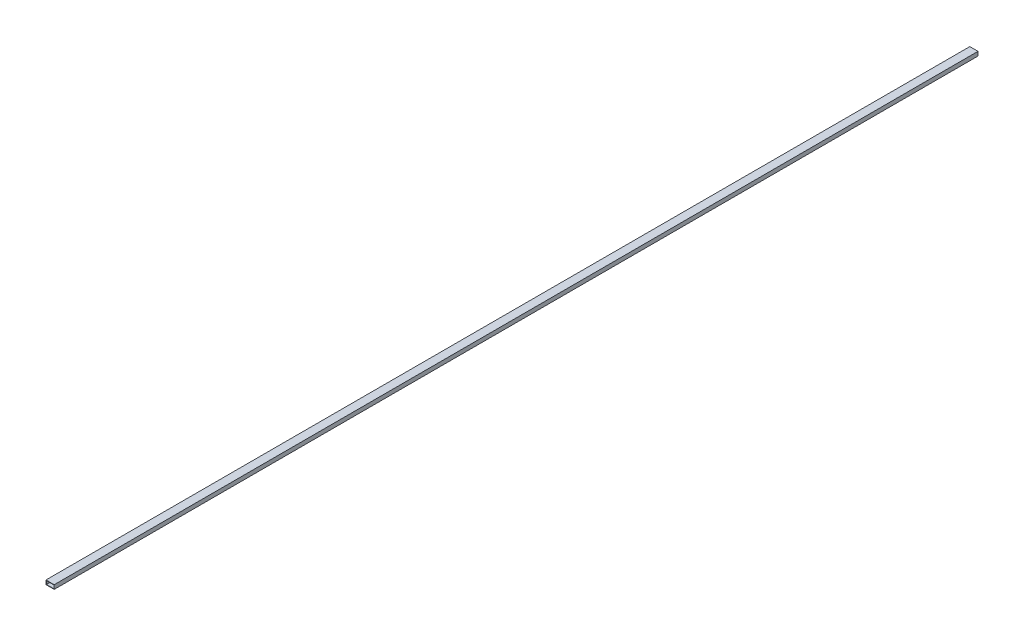
ISO-10303-21;
HEADER;
FILE_DESCRIPTION(('STEP AP214'),'2;1');
FILE_NAME('part.step','',(''),(''),'','','');
FILE_SCHEMA(('AUTOMOTIVE_DESIGN { 1 0 10303 214 1 1 1 1 }'));
ENDSEC;
DATA;
#1=APPLICATION_CONTEXT('core data for automotive mechanical design processes');
#2=APPLICATION_PROTOCOL_DEFINITION('international standard','automotive_design',2000,#1);
#3=PRODUCT_CONTEXT('',#1,'mechanical');
#4=PRODUCT('Part','Part','',(#3));
#5=PRODUCT_RELATED_PRODUCT_CATEGORY('part','',(#4));
#6=PRODUCT_DEFINITION_FORMATION('','',#4);
#7=PRODUCT_DEFINITION_CONTEXT('part definition',#1,'design');
#8=PRODUCT_DEFINITION('design','',#6,#7);
#9=PRODUCT_DEFINITION_SHAPE('','',#8);
#10=(LENGTH_UNIT() NAMED_UNIT(*) SI_UNIT(.MILLI.,.METRE.));
#11=(NAMED_UNIT(*) PLANE_ANGLE_UNIT() SI_UNIT($,.RADIAN.));
#12=(NAMED_UNIT(*) SI_UNIT($,.STERADIAN.) SOLID_ANGLE_UNIT());
#13=UNCERTAINTY_MEASURE_WITH_UNIT(LENGTH_MEASURE(1.E-05),#10,'distance_accuracy_value','');
#14=(GEOMETRIC_REPRESENTATION_CONTEXT(3) GLOBAL_UNCERTAINTY_ASSIGNED_CONTEXT((#13)) GLOBAL_UNIT_ASSIGNED_CONTEXT((#10,
#11,#12)) REPRESENTATION_CONTEXT('',''));
#15=CARTESIAN_POINT('',(0.,0.,0.));
#16=DIRECTION('',(0.,0.,1.));
#17=DIRECTION('',(1.,0.,0.));
#18=AXIS2_PLACEMENT_3D('',#15,#16,#17);
#19=CARTESIAN_POINT('',(0.,0.,2250.));
#20=DIRECTION('',(0.,0.,-1.));
#21=DIRECTION('',(-1.,0.,0.));
#22=AXIS2_PLACEMENT_3D('',#19,#20,#21);
#23=PLANE('',#22);
#24=DIRECTION('',(0.,-1.,0.));
#25=VECTOR('',#24,1.);
#26=CARTESIAN_POINT('',(0.,0.,2250.));
#27=LINE('',#26,#25);
#28=CARTESIAN_POINT('',(0.,10.,2250.));
#29=VERTEX_POINT('',#28);
#30=CARTESIAN_POINT('',(0.,0.,2250.));
#31=VERTEX_POINT('',#30);
#32=EDGE_CURVE('E136',#29,#31,#27,.T.);
#33=ORIENTED_EDGE('',*,*,#32,.T.);
#34=DIRECTION('',(1.,0.,0.));
#35=VECTOR('',#34,1.);
#36=CARTESIAN_POINT('',(0.,0.,2250.));
#37=LINE('',#36,#35);
#38=CARTESIAN_POINT('',(20.,0.,2250.));
#39=VERTEX_POINT('',#38);
#40=EDGE_CURVE('E139',#31,#39,#37,.T.);
#41=ORIENTED_EDGE('',*,*,#40,.T.);
#42=DIRECTION('',(0.,1.,0.));
#43=VECTOR('',#42,1.);
#44=CARTESIAN_POINT('',(20.,0.,2250.));
#45=LINE('',#44,#43);
#46=CARTESIAN_POINT('',(20.,10.,2250.));
#47=VERTEX_POINT('',#46);
#48=EDGE_CURVE('E142',#39,#47,#45,.T.);
#49=ORIENTED_EDGE('',*,*,#48,.T.);
#50=DIRECTION('',(-1.,0.,0.));
#51=VECTOR('',#50,1.);
#52=CARTESIAN_POINT('',(0.,10.,2250.));
#53=LINE('',#52,#51);
#54=EDGE_CURVE('E144',#47,#29,#53,.T.);
#55=ORIENTED_EDGE('',*,*,#54,.T.);
#56=EDGE_LOOP('',(#33,#41,#49,#55));
#57=FACE_BOUND('',#56,.T.);
#58=DIRECTION('',(0.,-1.,0.));
#59=VECTOR('',#58,1.);
#60=CARTESIAN_POINT('',(1.,1.,2250.));
#61=LINE('',#60,#59);
#62=CARTESIAN_POINT('',(1.,9.,2250.));
#63=VERTEX_POINT('',#62);
#64=CARTESIAN_POINT('',(1.,1.,2250.));
#65=VERTEX_POINT('',#64);
#66=EDGE_CURVE('E100',#63,#65,#61,.T.);
#67=ORIENTED_EDGE('',*,*,#66,.F.);
#68=DIRECTION('',(-1.,0.,0.));
#69=VECTOR('',#68,1.);
#70=CARTESIAN_POINT('',(1.,9.,2250.));
#71=LINE('',#70,#69);
#72=CARTESIAN_POINT('',(19.,9.,2250.));
#73=VERTEX_POINT('',#72);
#74=EDGE_CURVE('E122',#73,#63,#71,.T.);
#75=ORIENTED_EDGE('',*,*,#74,.F.);
#76=DIRECTION('',(0.,1.,0.));
#77=VECTOR('',#76,1.);
#78=CARTESIAN_POINT('',(19.,1.,2250.));
#79=LINE('',#78,#77);
#80=CARTESIAN_POINT('',(19.,1.,2250.));
#81=VERTEX_POINT('',#80);
#82=EDGE_CURVE('E120',#81,#73,#79,.T.);
#83=ORIENTED_EDGE('',*,*,#82,.F.);
#84=DIRECTION('',(1.,0.,0.));
#85=VECTOR('',#84,1.);
#86=CARTESIAN_POINT('',(1.,1.,2250.));
#87=LINE('',#86,#85);
#88=EDGE_CURVE('E108',#65,#81,#87,.T.);
#89=ORIENTED_EDGE('',*,*,#88,.F.);
#90=EDGE_LOOP('',(#67,#75,#83,#89));
#91=FACE_BOUND('',#90,.T.);
#92=ADVANCED_FACE('F35',(#57,#91),#23,.F.);
#93=CARTESIAN_POINT('',(0.,0.,0.));
#94=DIRECTION('',(0.,0.,-1.));
#95=DIRECTION('',(-1.,0.,0.));
#96=AXIS2_PLACEMENT_3D('',#93,#94,#95);
#97=PLANE('',#96);
#98=DIRECTION('',(0.,-1.,0.));
#99=VECTOR('',#98,1.);
#100=CARTESIAN_POINT('',(0.,0.,0.));
#101=LINE('',#100,#99);
#102=CARTESIAN_POINT('',(0.,10.,0.));
#103=VERTEX_POINT('',#102);
#104=CARTESIAN_POINT('',(0.,0.,0.));
#105=VERTEX_POINT('',#104);
#106=EDGE_CURVE('E116',#103,#105,#101,.T.);
#107=ORIENTED_EDGE('',*,*,#106,.F.);
#108=DIRECTION('',(-1.,0.,0.));
#109=VECTOR('',#108,1.);
#110=CARTESIAN_POINT('',(0.,10.,0.));
#111=LINE('',#110,#109);
#112=CARTESIAN_POINT('',(20.,10.,0.));
#113=VERTEX_POINT('',#112);
#114=EDGE_CURVE('E140',#113,#103,#111,.T.);
#115=ORIENTED_EDGE('',*,*,#114,.F.);
#116=DIRECTION('',(0.,1.,0.));
#117=VECTOR('',#116,1.);
#118=CARTESIAN_POINT('',(20.,0.,0.));
#119=LINE('',#118,#117);
#120=CARTESIAN_POINT('',(20.,0.,0.));
#121=VERTEX_POINT('',#120);
#122=EDGE_CURVE('E151',#121,#113,#119,.T.);
#123=ORIENTED_EDGE('',*,*,#122,.F.);
#124=DIRECTION('',(1.,0.,0.));
#125=VECTOR('',#124,1.);
#126=CARTESIAN_POINT('',(0.,0.,0.));
#127=LINE('',#126,#125);
#128=EDGE_CURVE('E149',#105,#121,#127,.T.);
#129=ORIENTED_EDGE('',*,*,#128,.F.);
#130=EDGE_LOOP('',(#107,#115,#123,#129));
#131=FACE_BOUND('',#130,.T.);
#132=DIRECTION('',(-1.,0.,0.));
#133=VECTOR('',#132,1.);
#134=CARTESIAN_POINT('',(1.,9.,0.));
#135=LINE('',#134,#133);
#136=CARTESIAN_POINT('',(19.,9.,0.));
#137=VERTEX_POINT('',#136);
#138=CARTESIAN_POINT('',(1.,9.,0.));
#139=VERTEX_POINT('',#138);
#140=EDGE_CURVE('E109',#137,#139,#135,.T.);
#141=ORIENTED_EDGE('',*,*,#140,.T.);
#142=DIRECTION('',(0.,-1.,0.));
#143=VECTOR('',#142,1.);
#144=CARTESIAN_POINT('',(1.,1.,0.));
#145=LINE('',#144,#143);
#146=CARTESIAN_POINT('',(1.,1.,0.));
#147=VERTEX_POINT('',#146);
#148=EDGE_CURVE('E58',#139,#147,#145,.T.);
#149=ORIENTED_EDGE('',*,*,#148,.T.);
#150=DIRECTION('',(1.,0.,0.));
#151=VECTOR('',#150,1.);
#152=CARTESIAN_POINT('',(1.,1.,0.));
#153=LINE('',#152,#151);
#154=CARTESIAN_POINT('',(19.,1.,0.));
#155=VERTEX_POINT('',#154);
#156=EDGE_CURVE('E115',#147,#155,#153,.T.);
#157=ORIENTED_EDGE('',*,*,#156,.T.);
#158=DIRECTION('',(0.,1.,0.));
#159=VECTOR('',#158,1.);
#160=CARTESIAN_POINT('',(19.,1.,0.));
#161=LINE('',#160,#159);
#162=EDGE_CURVE('E128',#155,#137,#161,.T.);
#163=ORIENTED_EDGE('',*,*,#162,.T.);
#164=EDGE_LOOP('',(#141,#149,#157,#163));
#165=FACE_BOUND('',#164,.T.);
#166=ADVANCED_FACE('F169',(#131,#165),#97,.T.);
#167=CARTESIAN_POINT('',(0.,0.,2250.));
#168=DIRECTION('',(1.,0.,0.));
#169=DIRECTION('',(0.,0.,-1.));
#170=AXIS2_PLACEMENT_3D('',#167,#168,#169);
#171=PLANE('',#170);
#172=ORIENTED_EDGE('',*,*,#106,.T.);
#173=DIRECTION('',(0.,0.,-1.));
#174=VECTOR('',#173,1.);
#175=CARTESIAN_POINT('',(0.,0.,2250.));
#176=LINE('',#175,#174);
#177=EDGE_CURVE('E11',#31,#105,#176,.T.);
#178=ORIENTED_EDGE('',*,*,#177,.F.);
#179=ORIENTED_EDGE('',*,*,#32,.F.);
#180=DIRECTION('',(0.,0.,-1.));
#181=VECTOR('',#180,1.);
#182=CARTESIAN_POINT('',(0.,10.,2250.));
#183=LINE('',#182,#181);
#184=EDGE_CURVE('E146',#29,#103,#183,.T.);
#185=ORIENTED_EDGE('',*,*,#184,.T.);
#186=EDGE_LOOP('',(#172,#178,#179,#185));
#187=FACE_BOUND('',#186,.T.);
#188=ADVANCED_FACE('F37',(#187),#171,.F.);
#189=CARTESIAN_POINT('',(0.,0.,2250.));
#190=DIRECTION('',(0.,1.,0.));
#191=DIRECTION('',(0.,0.,1.));
#192=AXIS2_PLACEMENT_3D('',#189,#190,#191);
#193=PLANE('',#192);
#194=ORIENTED_EDGE('',*,*,#128,.T.);
#195=DIRECTION('',(0.,0.,-1.));
#196=VECTOR('',#195,1.);
#197=CARTESIAN_POINT('',(20.,0.,2250.));
#198=LINE('',#197,#196);
#199=EDGE_CURVE('E43',#39,#121,#198,.T.);
#200=ORIENTED_EDGE('',*,*,#199,.F.);
#201=ORIENTED_EDGE('',*,*,#40,.F.);
#202=ORIENTED_EDGE('',*,*,#177,.T.);
#203=EDGE_LOOP('',(#194,#200,#201,#202));
#204=FACE_BOUND('',#203,.T.);
#205=ADVANCED_FACE('F179',(#204),#193,.F.);
#206=CARTESIAN_POINT('',(20.,0.,2250.));
#207=DIRECTION('',(-1.,0.,0.));
#208=DIRECTION('',(0.,0.,1.));
#209=AXIS2_PLACEMENT_3D('',#206,#207,#208);
#210=PLANE('',#209);
#211=ORIENTED_EDGE('',*,*,#122,.T.);
#212=DIRECTION('',(0.,0.,-1.));
#213=VECTOR('',#212,1.);
#214=CARTESIAN_POINT('',(20.,10.,2250.));
#215=LINE('',#214,#213);
#216=EDGE_CURVE('E156',#47,#113,#215,.T.);
#217=ORIENTED_EDGE('',*,*,#216,.F.);
#218=ORIENTED_EDGE('',*,*,#48,.F.);
#219=ORIENTED_EDGE('',*,*,#199,.T.);
#220=EDGE_LOOP('',(#211,#217,#218,#219));
#221=FACE_BOUND('',#220,.T.);
#222=ADVANCED_FACE('F163',(#221),#210,.F.);
#223=CARTESIAN_POINT('',(0.,10.,2250.));
#224=DIRECTION('',(0.,-1.,0.));
#225=DIRECTION('',(0.,0.,-1.));
#226=AXIS2_PLACEMENT_3D('',#223,#224,#225);
#227=PLANE('',#226);
#228=ORIENTED_EDGE('',*,*,#114,.T.);
#229=ORIENTED_EDGE('',*,*,#184,.F.);
#230=ORIENTED_EDGE('',*,*,#54,.F.);
#231=ORIENTED_EDGE('',*,*,#216,.T.);
#232=EDGE_LOOP('',(#228,#229,#230,#231));
#233=FACE_BOUND('',#232,.T.);
#234=ADVANCED_FACE('F173',(#233),#227,.F.);
#235=CARTESIAN_POINT('',(1.,1.,2250.));
#236=DIRECTION('',(1.,0.,0.));
#237=DIRECTION('',(0.,0.,-1.));
#238=AXIS2_PLACEMENT_3D('',#235,#236,#237);
#239=PLANE('',#238);
#240=ORIENTED_EDGE('',*,*,#148,.F.);
#241=DIRECTION('',(0.,0.,-1.));
#242=VECTOR('',#241,1.);
#243=CARTESIAN_POINT('',(1.,9.,2250.));
#244=LINE('',#243,#242);
#245=EDGE_CURVE('E104',#63,#139,#244,.T.);
#246=ORIENTED_EDGE('',*,*,#245,.F.);
#247=ORIENTED_EDGE('',*,*,#66,.T.);
#248=DIRECTION('',(0.,0.,-1.));
#249=VECTOR('',#248,1.);
#250=CARTESIAN_POINT('',(1.,1.,2250.));
#251=LINE('',#250,#249);
#252=EDGE_CURVE('E103',#65,#147,#251,.T.);
#253=ORIENTED_EDGE('',*,*,#252,.T.);
#254=EDGE_LOOP('',(#240,#246,#247,#253));
#255=FACE_BOUND('',#254,.T.);
#256=ADVANCED_FACE('F102',(#255),#239,.T.);
#257=CARTESIAN_POINT('',(1.,1.,2250.));
#258=DIRECTION('',(0.,1.,0.));
#259=DIRECTION('',(0.,0.,1.));
#260=AXIS2_PLACEMENT_3D('',#257,#258,#259);
#261=PLANE('',#260);
#262=ORIENTED_EDGE('',*,*,#156,.F.);
#263=ORIENTED_EDGE('',*,*,#252,.F.);
#264=ORIENTED_EDGE('',*,*,#88,.T.);
#265=DIRECTION('',(0.,0.,-1.));
#266=VECTOR('',#265,1.);
#267=CARTESIAN_POINT('',(19.,1.,2250.));
#268=LINE('',#267,#266);
#269=EDGE_CURVE('E117',#81,#155,#268,.T.);
#270=ORIENTED_EDGE('',*,*,#269,.T.);
#271=EDGE_LOOP('',(#262,#263,#264,#270));
#272=FACE_BOUND('',#271,.T.);
#273=ADVANCED_FACE('F112',(#272),#261,.T.);
#274=CARTESIAN_POINT('',(19.,1.,2250.));
#275=DIRECTION('',(-1.,0.,0.));
#276=DIRECTION('',(0.,0.,1.));
#277=AXIS2_PLACEMENT_3D('',#274,#275,#276);
#278=PLANE('',#277);
#279=ORIENTED_EDGE('',*,*,#162,.F.);
#280=ORIENTED_EDGE('',*,*,#269,.F.);
#281=ORIENTED_EDGE('',*,*,#82,.T.);
#282=DIRECTION('',(0.,0.,-1.));
#283=VECTOR('',#282,1.);
#284=CARTESIAN_POINT('',(19.,9.,2250.));
#285=LINE('',#284,#283);
#286=EDGE_CURVE('E50',#73,#137,#285,.T.);
#287=ORIENTED_EDGE('',*,*,#286,.T.);
#288=EDGE_LOOP('',(#279,#280,#281,#287));
#289=FACE_BOUND('',#288,.T.);
#290=ADVANCED_FACE('F202',(#289),#278,.T.);
#291=CARTESIAN_POINT('',(1.,9.,2250.));
#292=DIRECTION('',(0.,-1.,0.));
#293=DIRECTION('',(0.,0.,-1.));
#294=AXIS2_PLACEMENT_3D('',#291,#292,#293);
#295=PLANE('',#294);
#296=ORIENTED_EDGE('',*,*,#140,.F.);
#297=ORIENTED_EDGE('',*,*,#286,.F.);
#298=ORIENTED_EDGE('',*,*,#74,.T.);
#299=ORIENTED_EDGE('',*,*,#245,.T.);
#300=EDGE_LOOP('',(#296,#297,#298,#299));
#301=FACE_BOUND('',#300,.T.);
#302=ADVANCED_FACE('F206',(#301),#295,.T.);
#303=CLOSED_SHELL('',(#92,#166,#188,#205,#222,#234,#256,#273,#290,#302));
#304=MANIFOLD_SOLID_BREP('B2',#303);
#305=ADVANCED_BREP_SHAPE_REPRESENTATION('',(#18,#304),#14);
#306=SHAPE_DEFINITION_REPRESENTATION(#9,#305);
ENDSEC;
END-ISO-10303-21;
